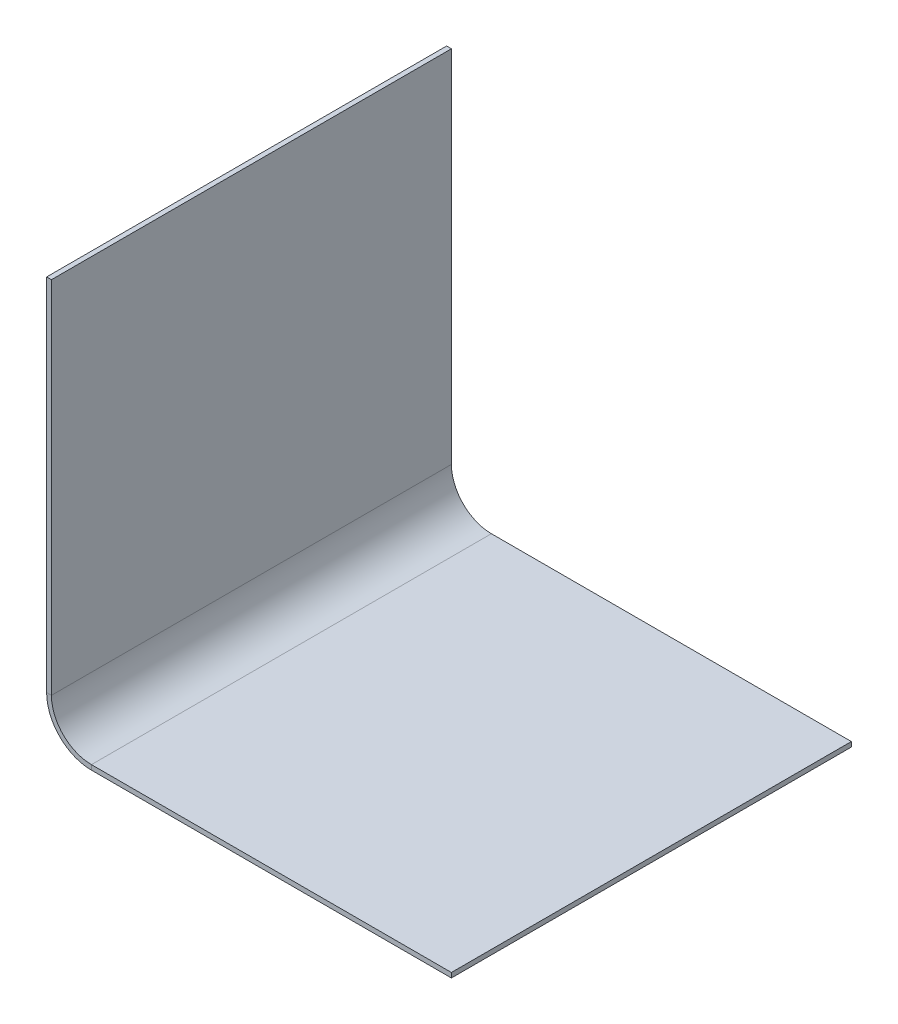
ISO-10303-21;
HEADER;
FILE_DESCRIPTION(('STEP AP214'),'2;1');
FILE_NAME('part.step','',(''),(''),'','','');
FILE_SCHEMA(('AUTOMOTIVE_DESIGN { 1 0 10303 214 1 1 1 1 }'));
ENDSEC;
DATA;
#1=APPLICATION_CONTEXT('core data for automotive mechanical design processes');
#2=APPLICATION_PROTOCOL_DEFINITION('international standard','automotive_design',2000,#1);
#3=PRODUCT_CONTEXT('',#1,'mechanical');
#4=PRODUCT('Part','Part','',(#3));
#5=PRODUCT_RELATED_PRODUCT_CATEGORY('part','',(#4));
#6=PRODUCT_DEFINITION_FORMATION('','',#4);
#7=PRODUCT_DEFINITION_CONTEXT('part definition',#1,'design');
#8=PRODUCT_DEFINITION('design','',#6,#7);
#9=PRODUCT_DEFINITION_SHAPE('','',#8);
#10=(LENGTH_UNIT() NAMED_UNIT(*) SI_UNIT(.MILLI.,.METRE.));
#11=(NAMED_UNIT(*) PLANE_ANGLE_UNIT() SI_UNIT($,.RADIAN.));
#12=(NAMED_UNIT(*) SI_UNIT($,.STERADIAN.) SOLID_ANGLE_UNIT());
#13=UNCERTAINTY_MEASURE_WITH_UNIT(LENGTH_MEASURE(1.E-05),#10,'distance_accuracy_value','');
#14=(GEOMETRIC_REPRESENTATION_CONTEXT(3) GLOBAL_UNCERTAINTY_ASSIGNED_CONTEXT((#13)) GLOBAL_UNIT_ASSIGNED_CONTEXT((#10,
#11,#12)) REPRESENTATION_CONTEXT('',''));
#15=CARTESIAN_POINT('',(0.,0.,0.));
#16=DIRECTION('',(0.,0.,1.));
#17=DIRECTION('',(1.,0.,0.));
#18=AXIS2_PLACEMENT_3D('',#15,#16,#17);
#19=CARTESIAN_POINT('',(-63.6746316559542,-37.7524540702753,100.));
#20=DIRECTION('',(0.,0.,1.));
#21=DIRECTION('',(1.,0.,0.));
#22=AXIS2_PLACEMENT_3D('',#19,#20,#21);
#23=PLANE('',#22);
#24=DIRECTION('',(0.,-1.,0.));
#25=VECTOR('',#24,1.);
#26=CARTESIAN_POINT('',(-63.6746316559542,-37.7524540702753,100.));
#27=LINE('',#26,#25);
#28=CARTESIAN_POINT('',(-63.6746316559542,-37.7524540702753,100.));
#29=VERTEX_POINT('',#28);
#30=CARTESIAN_POINT('',(-63.6746316559542,-38.9524540702753,100.));
#31=VERTEX_POINT('',#30);
#32=EDGE_CURVE('E11',#29,#31,#27,.T.);
#33=ORIENTED_EDGE('',*,*,#32,.F.);
#34=CARTESIAN_POINT('',(-63.6746316559543,-27.7524540702753,100.));
#35=DIRECTION('',(0.,0.,1.));
#36=DIRECTION('',(-1.,0.,0.));
#37=AXIS2_PLACEMENT_3D('',#34,#35,#36);
#38=CIRCLE('',#37,10.);
#39=CARTESIAN_POINT('',(-73.6746316559543,-27.7524540702753,100.));
#40=VERTEX_POINT('',#39);
#41=EDGE_CURVE('E147',#40,#29,#38,.T.);
#42=ORIENTED_EDGE('',*,*,#41,.F.);
#43=DIRECTION('',(1.,0.,0.));
#44=VECTOR('',#43,1.);
#45=CARTESIAN_POINT('',(-74.8746316559543,-27.7524540702753,100.));
#46=LINE('',#45,#44);
#47=CARTESIAN_POINT('',(-74.8746316559543,-27.7524540702753,100.));
#48=VERTEX_POINT('',#47);
#49=EDGE_CURVE('E53',#48,#40,#46,.T.);
#50=ORIENTED_EDGE('',*,*,#49,.F.);
#51=CARTESIAN_POINT('',(-63.6746316559543,-27.7524540702753,100.));
#52=DIRECTION('',(0.,0.,1.));
#53=DIRECTION('',(1.,0.,0.));
#54=AXIS2_PLACEMENT_3D('',#51,#52,#53);
#55=CIRCLE('',#54,11.2);
#56=EDGE_CURVE('E137',#48,#31,#55,.T.);
#57=ORIENTED_EDGE('',*,*,#56,.T.);
#58=EDGE_LOOP('',(#33,#42,#50,#57));
#59=FACE_BOUND('',#58,.T.);
#60=ADVANCED_FACE('F44',(#59),#23,.T.);
#61=CARTESIAN_POINT('',(-74.8746316559543,-27.7524540702753,100.));
#62=DIRECTION('',(0.,0.,1.));
#63=DIRECTION('',(1.,0.,0.));
#64=AXIS2_PLACEMENT_3D('',#61,#62,#63);
#65=PLANE('',#64);
#66=DIRECTION('',(1.,0.,0.));
#67=VECTOR('',#66,1.);
#68=CARTESIAN_POINT('',(-63.6746316559542,-37.7524540702753,100.));
#69=LINE('',#68,#67);
#70=CARTESIAN_POINT('',(26.3253683440457,-37.7524540702753,100.));
#71=VERTEX_POINT('',#70);
#72=EDGE_CURVE('E217',#29,#71,#69,.T.);
#73=ORIENTED_EDGE('',*,*,#72,.F.);
#74=ORIENTED_EDGE('',*,*,#32,.T.);
#75=DIRECTION('',(1.,0.,0.));
#76=VECTOR('',#75,1.);
#77=CARTESIAN_POINT('',(-63.6746316559542,-38.9524540702753,100.));
#78=LINE('',#77,#76);
#79=CARTESIAN_POINT('',(26.3253683440457,-38.9524540702753,100.));
#80=VERTEX_POINT('',#79);
#81=EDGE_CURVE('E101',#31,#80,#78,.T.);
#82=ORIENTED_EDGE('',*,*,#81,.T.);
#83=DIRECTION('',(0.,-1.,0.));
#84=VECTOR('',#83,1.);
#85=CARTESIAN_POINT('',(26.3253683440457,-37.7524540702753,100.));
#86=LINE('',#85,#84);
#87=EDGE_CURVE('E403',#71,#80,#86,.T.);
#88=ORIENTED_EDGE('',*,*,#87,.F.);
#89=EDGE_LOOP('',(#73,#74,#82,#88));
#90=FACE_BOUND('',#89,.T.);
#91=ADVANCED_FACE('F225',(#90),#65,.T.);
#92=CARTESIAN_POINT('',(-73.6746316559543,-27.7524540702753,0.));
#93=DIRECTION('',(0.,0.,-1.));
#94=DIRECTION('',(-1.,0.,0.));
#95=AXIS2_PLACEMENT_3D('',#92,#93,#94);
#96=PLANE('',#95);
#97=DIRECTION('',(-1.,0.,0.));
#98=VECTOR('',#97,1.);
#99=CARTESIAN_POINT('',(-73.6746316559543,-27.7524540702753,0.));
#100=LINE('',#99,#98);
#101=CARTESIAN_POINT('',(-73.6746316559543,-27.7524540702753,0.));
#102=VERTEX_POINT('',#101);
#103=CARTESIAN_POINT('',(-74.8746316559543,-27.7524540702753,0.));
#104=VERTEX_POINT('',#103);
#105=EDGE_CURVE('E88',#102,#104,#100,.T.);
#106=ORIENTED_EDGE('',*,*,#105,.F.);
#107=CARTESIAN_POINT('',(-63.6746316559543,-27.7524540702753,0.));
#108=DIRECTION('',(0.,0.,1.));
#109=DIRECTION('',(-1.,0.,0.));
#110=AXIS2_PLACEMENT_3D('',#107,#108,#109);
#111=CIRCLE('',#110,10.);
#112=CARTESIAN_POINT('',(-63.6746316559542,-37.7524540702753,0.));
#113=VERTEX_POINT('',#112);
#114=EDGE_CURVE('E166',#102,#113,#111,.T.);
#115=ORIENTED_EDGE('',*,*,#114,.T.);
#116=DIRECTION('',(0.,1.,0.));
#117=VECTOR('',#116,1.);
#118=CARTESIAN_POINT('',(-63.6746316559542,-38.9524540702753,0.));
#119=LINE('',#118,#117);
#120=CARTESIAN_POINT('',(-63.6746316559542,-38.9524540702753,0.));
#121=VERTEX_POINT('',#120);
#122=EDGE_CURVE('E95',#121,#113,#119,.T.);
#123=ORIENTED_EDGE('',*,*,#122,.F.);
#124=CARTESIAN_POINT('',(-63.6746316559543,-27.7524540702753,0.));
#125=DIRECTION('',(0.,0.,1.));
#126=DIRECTION('',(1.,0.,0.));
#127=AXIS2_PLACEMENT_3D('',#124,#125,#126);
#128=CIRCLE('',#127,11.2);
#129=EDGE_CURVE('E177',#104,#121,#128,.T.);
#130=ORIENTED_EDGE('',*,*,#129,.F.);
#131=EDGE_LOOP('',(#106,#115,#123,#130));
#132=FACE_BOUND('',#131,.T.);
#133=ADVANCED_FACE('F223',(#132),#96,.T.);
#134=CARTESIAN_POINT('',(-63.6746316559542,-38.9524540702753,0.));
#135=DIRECTION('',(0.,0.,-1.));
#136=DIRECTION('',(-1.,0.,0.));
#137=AXIS2_PLACEMENT_3D('',#134,#135,#136);
#138=PLANE('',#137);
#139=DIRECTION('',(0.,-1.,0.));
#140=VECTOR('',#139,1.);
#141=CARTESIAN_POINT('',(-73.6746316559543,62.2475459297247,0.));
#142=LINE('',#141,#140);
#143=CARTESIAN_POINT('',(-73.6746316559543,62.2475459297247,0.));
#144=VERTEX_POINT('',#143);
#145=EDGE_CURVE('E169',#144,#102,#142,.T.);
#146=ORIENTED_EDGE('',*,*,#145,.T.);
#147=ORIENTED_EDGE('',*,*,#105,.T.);
#148=DIRECTION('',(0.,1.,0.));
#149=VECTOR('',#148,1.);
#150=CARTESIAN_POINT('',(-74.8746316559543,62.2475459297247,0.));
#151=LINE('',#150,#149);
#152=CARTESIAN_POINT('',(-74.8746316559543,62.2475459297247,0.));
#153=VERTEX_POINT('',#152);
#154=EDGE_CURVE('E174',#153,#104,#151,.F.);
#155=ORIENTED_EDGE('',*,*,#154,.F.);
#156=DIRECTION('',(1.,0.,0.));
#157=VECTOR('',#156,1.);
#158=CARTESIAN_POINT('',(-74.8746316559543,62.2475459297247,0.));
#159=LINE('',#158,#157);
#160=EDGE_CURVE('E123',#153,#144,#159,.T.);
#161=ORIENTED_EDGE('',*,*,#160,.T.);
#162=EDGE_LOOP('',(#146,#147,#155,#161));
#163=FACE_BOUND('',#162,.T.);
#164=ADVANCED_FACE('F219',(#163),#138,.T.);
#165=CARTESIAN_POINT('',(-63.6746316559542,-38.9524540702753,100.));
#166=DIRECTION('',(0.,1.,0.));
#167=DIRECTION('',(-1.,0.,0.));
#168=AXIS2_PLACEMENT_3D('',#165,#166,#167);
#169=PLANE('',#168);
#170=DIRECTION('',(1.,0.,0.));
#171=VECTOR('',#170,1.);
#172=CARTESIAN_POINT('',(-63.6746316559542,-38.9524540702753,0.));
#173=LINE('',#172,#171);
#174=CARTESIAN_POINT('',(26.3253683440457,-38.9524540702753,0.));
#175=VERTEX_POINT('',#174);
#176=EDGE_CURVE('E154',#121,#175,#173,.T.);
#177=ORIENTED_EDGE('',*,*,#176,.T.);
#178=DIRECTION('',(0.,0.,-1.));
#179=VECTOR('',#178,1.);
#180=CARTESIAN_POINT('',(26.3253683440457,-38.9524540702753,100.));
#181=LINE('',#180,#179);
#182=EDGE_CURVE('E198',#80,#175,#181,.T.);
#183=ORIENTED_EDGE('',*,*,#182,.F.);
#184=ORIENTED_EDGE('',*,*,#81,.F.);
#185=DIRECTION('',(0.,0.,-1.));
#186=VECTOR('',#185,1.);
#187=CARTESIAN_POINT('',(-63.6746316559542,-38.9524540702753,100.));
#188=LINE('',#187,#186);
#189=EDGE_CURVE('E153',#31,#121,#188,.T.);
#190=ORIENTED_EDGE('',*,*,#189,.T.);
#191=EDGE_LOOP('',(#177,#183,#184,#190));
#192=FACE_BOUND('',#191,.T.);
#193=ADVANCED_FACE('F231',(#192),#169,.F.);
#194=CARTESIAN_POINT('',(26.3253683440457,-37.7524540702753,100.));
#195=DIRECTION('',(1.,0.,0.));
#196=DIRECTION('',(0.,0.,-1.));
#197=AXIS2_PLACEMENT_3D('',#194,#195,#196);
#198=PLANE('',#197);
#199=DIRECTION('',(0.,-1.,0.));
#200=VECTOR('',#199,1.);
#201=CARTESIAN_POINT('',(26.3253683440457,-37.7524540702753,0.));
#202=LINE('',#201,#200);
#203=CARTESIAN_POINT('',(26.3253683440457,-37.7524540702753,0.));
#204=VERTEX_POINT('',#203);
#205=EDGE_CURVE('E158',#204,#175,#202,.T.);
#206=ORIENTED_EDGE('',*,*,#205,.F.);
#207=DIRECTION('',(0.,0.,-1.));
#208=VECTOR('',#207,1.);
#209=CARTESIAN_POINT('',(26.3253683440457,-37.7524540702753,100.));
#210=LINE('',#209,#208);
#211=EDGE_CURVE('E195',#71,#204,#210,.T.);
#212=ORIENTED_EDGE('',*,*,#211,.F.);
#213=ORIENTED_EDGE('',*,*,#87,.T.);
#214=ORIENTED_EDGE('',*,*,#182,.T.);
#215=EDGE_LOOP('',(#206,#212,#213,#214));
#216=FACE_BOUND('',#215,.T.);
#217=ADVANCED_FACE('F259',(#216),#198,.T.);
#218=CARTESIAN_POINT('',(-63.6746316559542,-37.7524540702753,100.));
#219=DIRECTION('',(0.,1.,0.));
#220=DIRECTION('',(-1.,0.,0.));
#221=AXIS2_PLACEMENT_3D('',#218,#219,#220);
#222=PLANE('',#221);
#223=DIRECTION('',(1.,0.,0.));
#224=VECTOR('',#223,1.);
#225=CARTESIAN_POINT('',(-63.6746316559542,-37.7524540702753,0.));
#226=LINE('',#225,#224);
#227=EDGE_CURVE('E162',#113,#204,#226,.T.);
#228=ORIENTED_EDGE('',*,*,#227,.F.);
#229=DIRECTION('',(0.,0.,-1.));
#230=VECTOR('',#229,1.);
#231=CARTESIAN_POINT('',(-63.6746316559542,-37.7524540702753,100.));
#232=LINE('',#231,#230);
#233=EDGE_CURVE('E191',#29,#113,#232,.T.);
#234=ORIENTED_EDGE('',*,*,#233,.F.);
#235=ORIENTED_EDGE('',*,*,#72,.T.);
#236=ORIENTED_EDGE('',*,*,#211,.T.);
#237=EDGE_LOOP('',(#228,#234,#235,#236));
#238=FACE_BOUND('',#237,.T.);
#239=ADVANCED_FACE('F269',(#238),#222,.T.);
#240=CARTESIAN_POINT('',(-63.6746316559543,-27.7524540702753,100.));
#241=DIRECTION('',(0.,0.,-1.));
#242=DIRECTION('',(-1.,0.,0.));
#243=AXIS2_PLACEMENT_3D('',#240,#241,#242);
#244=CYLINDRICAL_SURFACE('',#243,10.);
#245=ORIENTED_EDGE('',*,*,#114,.F.);
#246=DIRECTION('',(0.,0.,-1.));
#247=VECTOR('',#246,1.);
#248=CARTESIAN_POINT('',(-73.6746316559543,-27.7524540702753,100.));
#249=LINE('',#248,#247);
#250=EDGE_CURVE('E187',#40,#102,#249,.T.);
#251=ORIENTED_EDGE('',*,*,#250,.F.);
#252=ORIENTED_EDGE('',*,*,#41,.T.);
#253=ORIENTED_EDGE('',*,*,#233,.T.);
#254=EDGE_LOOP('',(#245,#251,#252,#253));
#255=FACE_BOUND('',#254,.T.);
#256=ADVANCED_FACE('F212',(#255),#244,.F.);
#257=CARTESIAN_POINT('',(-73.6746316559543,62.2475459297247,100.));
#258=DIRECTION('',(1.,0.,0.));
#259=DIRECTION('',(0.,0.,-1.));
#260=AXIS2_PLACEMENT_3D('',#257,#258,#259);
#261=PLANE('',#260);
#262=ORIENTED_EDGE('',*,*,#145,.F.);
#263=DIRECTION('',(0.,0.,-1.));
#264=VECTOR('',#263,1.);
#265=CARTESIAN_POINT('',(-73.6746316559543,62.2475459297247,100.));
#266=LINE('',#265,#264);
#267=CARTESIAN_POINT('',(-73.6746316559543,62.2475459297247,100.));
#268=VERTEX_POINT('',#267);
#269=EDGE_CURVE('E126',#268,#144,#266,.T.);
#270=ORIENTED_EDGE('',*,*,#269,.F.);
#271=DIRECTION('',(0.,-1.,0.));
#272=VECTOR('',#271,1.);
#273=CARTESIAN_POINT('',(-73.6746316559543,62.2475459297247,100.));
#274=LINE('',#273,#272);
#275=EDGE_CURVE('E142',#268,#40,#274,.T.);
#276=ORIENTED_EDGE('',*,*,#275,.T.);
#277=ORIENTED_EDGE('',*,*,#250,.T.);
#278=EDGE_LOOP('',(#262,#270,#276,#277));
#279=FACE_BOUND('',#278,.T.);
#280=ADVANCED_FACE('F218',(#279),#261,.T.);
#281=CARTESIAN_POINT('',(-74.8746316559543,62.2475459297247,100.));
#282=DIRECTION('',(0.,1.,0.));
#283=DIRECTION('',(0.,0.,1.));
#284=AXIS2_PLACEMENT_3D('',#281,#282,#283);
#285=PLANE('',#284);
#286=ORIENTED_EDGE('',*,*,#160,.F.);
#287=DIRECTION('',(0.,0.,-1.));
#288=VECTOR('',#287,1.);
#289=CARTESIAN_POINT('',(-74.8746316559543,62.2475459297247,100.));
#290=LINE('',#289,#288);
#291=CARTESIAN_POINT('',(-74.8746316559543,62.2475459297247,100.));
#292=VERTEX_POINT('',#291);
#293=EDGE_CURVE('E117',#292,#153,#290,.T.);
#294=ORIENTED_EDGE('',*,*,#293,.F.);
#295=DIRECTION('',(1.,0.,0.));
#296=VECTOR('',#295,1.);
#297=CARTESIAN_POINT('',(-74.8746316559543,62.2475459297247,100.));
#298=LINE('',#297,#296);
#299=EDGE_CURVE('E121',#292,#268,#298,.T.);
#300=ORIENTED_EDGE('',*,*,#299,.T.);
#301=ORIENTED_EDGE('',*,*,#269,.T.);
#302=EDGE_LOOP('',(#286,#294,#300,#301));
#303=FACE_BOUND('',#302,.T.);
#304=ADVANCED_FACE('F119',(#303),#285,.T.);
#305=CARTESIAN_POINT('',(-74.8746316559543,62.2475459297247,100.));
#306=DIRECTION('',(1.,0.,0.));
#307=DIRECTION('',(0.,0.,-1.));
#308=AXIS2_PLACEMENT_3D('',#305,#306,#307);
#309=PLANE('',#308);
#310=ORIENTED_EDGE('',*,*,#154,.T.);
#311=DIRECTION('',(0.,0.,-1.));
#312=VECTOR('',#311,1.);
#313=CARTESIAN_POINT('',(-74.8746316559543,-27.7524540702753,100.));
#314=LINE('',#313,#312);
#315=EDGE_CURVE('E127',#48,#104,#314,.T.);
#316=ORIENTED_EDGE('',*,*,#315,.F.);
#317=DIRECTION('',(0.,1.,0.));
#318=VECTOR('',#317,1.);
#319=CARTESIAN_POINT('',(-74.8746316559543,62.2475459297247,100.));
#320=LINE('',#319,#318);
#321=EDGE_CURVE('E131',#292,#48,#320,.F.);
#322=ORIENTED_EDGE('',*,*,#321,.F.);
#323=ORIENTED_EDGE('',*,*,#293,.T.);
#324=EDGE_LOOP('',(#310,#316,#322,#323));
#325=FACE_BOUND('',#324,.T.);
#326=ADVANCED_FACE('F132',(#325),#309,.F.);
#327=CARTESIAN_POINT('',(-63.6746316559543,-27.7524540702753,100.));
#328=DIRECTION('',(0.,0.,-1.));
#329=DIRECTION('',(-1.,0.,0.));
#330=AXIS2_PLACEMENT_3D('',#327,#328,#329);
#331=CYLINDRICAL_SURFACE('',#330,11.2);
#332=ORIENTED_EDGE('',*,*,#129,.T.);
#333=ORIENTED_EDGE('',*,*,#189,.F.);
#334=ORIENTED_EDGE('',*,*,#56,.F.);
#335=ORIENTED_EDGE('',*,*,#315,.T.);
#336=EDGE_LOOP('',(#332,#333,#334,#335));
#337=FACE_BOUND('',#336,.T.);
#338=ADVANCED_FACE('F221',(#337),#331,.T.);
#339=CARTESIAN_POINT('',(-63.6746316559543,-27.7524540702753,100.));
#340=DIRECTION('',(0.,0.,1.));
#341=DIRECTION('',(1.,0.,0.));
#342=AXIS2_PLACEMENT_3D('',#339,#340,#341);
#343=PLANE('',#342);
#344=ORIENTED_EDGE('',*,*,#321,.T.);
#345=ORIENTED_EDGE('',*,*,#49,.T.);
#346=ORIENTED_EDGE('',*,*,#275,.F.);
#347=ORIENTED_EDGE('',*,*,#299,.F.);
#348=EDGE_LOOP('',(#344,#345,#346,#347));
#349=FACE_BOUND('',#348,.T.);
#350=ADVANCED_FACE('F140',(#349),#343,.T.);
#351=CARTESIAN_POINT('',(-63.6746316559543,-27.7524540702753,0.));
#352=DIRECTION('',(0.,0.,1.));
#353=DIRECTION('',(1.,0.,0.));
#354=AXIS2_PLACEMENT_3D('',#351,#352,#353);
#355=PLANE('',#354);
#356=ORIENTED_EDGE('',*,*,#176,.F.);
#357=ORIENTED_EDGE('',*,*,#122,.T.);
#358=ORIENTED_EDGE('',*,*,#227,.T.);
#359=ORIENTED_EDGE('',*,*,#205,.T.);
#360=EDGE_LOOP('',(#356,#357,#358,#359));
#361=FACE_BOUND('',#360,.T.);
#362=ADVANCED_FACE('F328',(#361),#355,.F.);
#363=CLOSED_SHELL('',(#60,#91,#133,#164,#193,#217,#239,#256,#280,#304,#326,#338,#350,#362));
#364=MANIFOLD_SOLID_BREP('B2',#363);
#365=ADVANCED_BREP_SHAPE_REPRESENTATION('',(#18,#364),#14);
#366=SHAPE_DEFINITION_REPRESENTATION(#9,#365);
ENDSEC;
END-ISO-10303-21;
